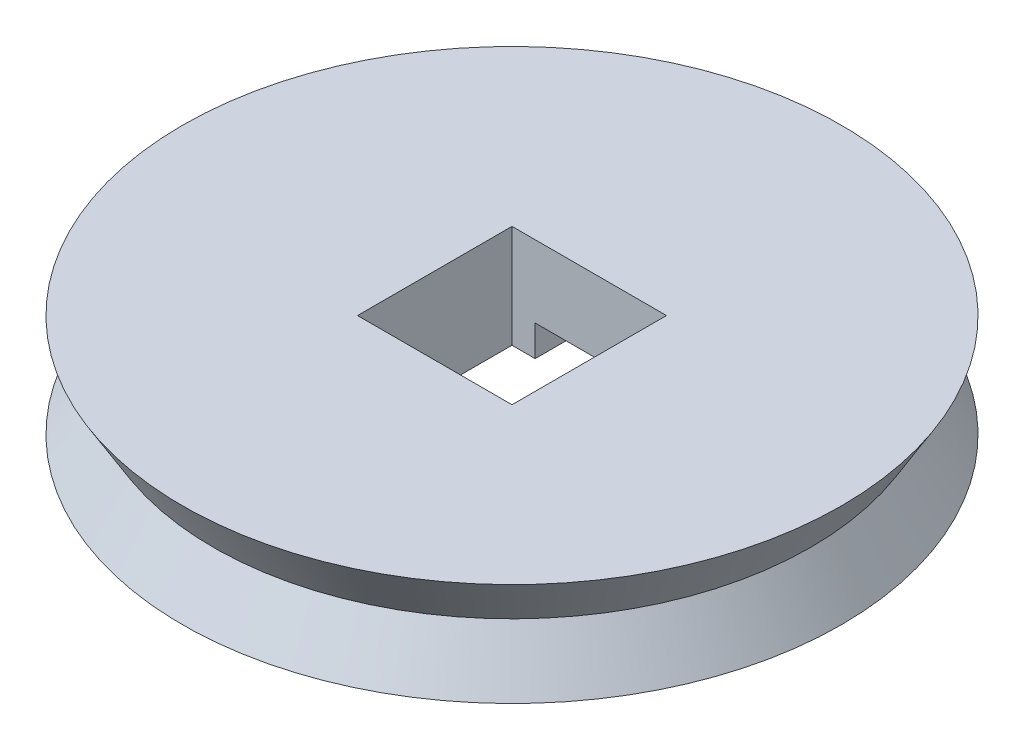
ISO-10303-21;
HEADER;
FILE_DESCRIPTION(('STEP AP214'),'2;1');
FILE_NAME('part.step','',(''),(''),'','','');
FILE_SCHEMA(('AUTOMOTIVE_DESIGN { 1 0 10303 214 1 1 1 1 }'));
ENDSEC;
DATA;
#1=APPLICATION_CONTEXT('core data for automotive mechanical design processes');
#2=APPLICATION_PROTOCOL_DEFINITION('international standard','automotive_design',2000,#1);
#3=PRODUCT_CONTEXT('',#1,'mechanical');
#4=PRODUCT('Part','Part','',(#3));
#5=PRODUCT_RELATED_PRODUCT_CATEGORY('part','',(#4));
#6=PRODUCT_DEFINITION_FORMATION('','',#4);
#7=PRODUCT_DEFINITION_CONTEXT('part definition',#1,'design');
#8=PRODUCT_DEFINITION('design','',#6,#7);
#9=PRODUCT_DEFINITION_SHAPE('','',#8);
#10=(LENGTH_UNIT() NAMED_UNIT(*) SI_UNIT(.MILLI.,.METRE.));
#11=(NAMED_UNIT(*) PLANE_ANGLE_UNIT() SI_UNIT($,.RADIAN.));
#12=(NAMED_UNIT(*) SI_UNIT($,.STERADIAN.) SOLID_ANGLE_UNIT());
#13=UNCERTAINTY_MEASURE_WITH_UNIT(LENGTH_MEASURE(1.E-05),#10,'distance_accuracy_value','');
#14=(GEOMETRIC_REPRESENTATION_CONTEXT(3) GLOBAL_UNCERTAINTY_ASSIGNED_CONTEXT((#13)) GLOBAL_UNIT_ASSIGNED_CONTEXT((#10,
#11,#12)) REPRESENTATION_CONTEXT('',''));
#15=CARTESIAN_POINT('',(0.,0.,0.));
#16=DIRECTION('',(0.,0.,1.));
#17=DIRECTION('',(1.,0.,0.));
#18=AXIS2_PLACEMENT_3D('',#15,#16,#17);
#19=CARTESIAN_POINT('',(0.,0.,0.));
#20=DIRECTION('',(0.,1.,0.));
#21=DIRECTION('',(0.,0.,1.));
#22=AXIS2_PLACEMENT_3D('',#19,#20,#21);
#23=PLANE('',#22);
#24=CARTESIAN_POINT('',(0.,0.,0.));
#25=DIRECTION('',(0.,1.,0.));
#26=DIRECTION('',(0.,0.,1.));
#27=AXIS2_PLACEMENT_3D('',#24,#25,#26);
#28=CIRCLE('',#27,32.);
#29=CARTESIAN_POINT('',(32.,0.,0.));
#30=VERTEX_POINT('',#29);
#31=EDGE_CURVE('E45',#30,#30,#28,.T.);
#32=ORIENTED_EDGE('',*,*,#31,.F.);
#33=EDGE_LOOP('',(#32));
#34=FACE_BOUND('',#33,.T.);
#35=DIRECTION('',(0.,0.,1.));
#36=VECTOR('',#35,1.);
#37=CARTESIAN_POINT('',(5.25,0.,7.5));
#38=LINE('',#37,#36);
#39=CARTESIAN_POINT('',(5.25,0.,7.5));
#40=VERTEX_POINT('',#39);
#41=CARTESIAN_POINT('',(5.25,0.,18.));
#42=VERTEX_POINT('',#41);
#43=EDGE_CURVE('E144',#40,#42,#38,.T.);
#44=ORIENTED_EDGE('',*,*,#43,.F.);
#45=DIRECTION('',(1.,0.,0.));
#46=VECTOR('',#45,1.);
#47=CARTESIAN_POINT('',(-7.5,0.,7.5));
#48=LINE('',#47,#46);
#49=CARTESIAN_POINT('',(7.5,0.,7.5));
#50=VERTEX_POINT('',#49);
#51=EDGE_CURVE('E209',#40,#50,#48,.T.);
#52=ORIENTED_EDGE('',*,*,#51,.T.);
#53=DIRECTION('',(0.,0.,-1.));
#54=VECTOR('',#53,1.);
#55=CARTESIAN_POINT('',(7.5,0.,7.5));
#56=LINE('',#55,#54);
#57=CARTESIAN_POINT('',(7.5,0.,-7.5));
#58=VERTEX_POINT('',#57);
#59=EDGE_CURVE('E200',#50,#58,#56,.T.);
#60=ORIENTED_EDGE('',*,*,#59,.T.);
#61=DIRECTION('',(-1.,0.,0.));
#62=VECTOR('',#61,1.);
#63=CARTESIAN_POINT('',(-7.5,0.,-7.5));
#64=LINE('',#63,#62);
#65=CARTESIAN_POINT('',(5.25,0.,-7.5));
#66=VERTEX_POINT('',#65);
#67=EDGE_CURVE('E204',#58,#66,#64,.T.);
#68=ORIENTED_EDGE('',*,*,#67,.T.);
#69=DIRECTION('',(0.,0.,1.));
#70=VECTOR('',#69,1.);
#71=CARTESIAN_POINT('',(5.25,0.,-7.5));
#72=LINE('',#71,#70);
#73=CARTESIAN_POINT('',(5.25,0.,-18.));
#74=VERTEX_POINT('',#73);
#75=EDGE_CURVE('E167',#74,#66,#72,.T.);
#76=ORIENTED_EDGE('',*,*,#75,.F.);
#77=DIRECTION('',(1.,0.,0.));
#78=VECTOR('',#77,1.);
#79=CARTESIAN_POINT('',(5.25,0.,-18.));
#80=LINE('',#79,#78);
#81=CARTESIAN_POINT('',(-5.24999999999999,0.,-18.));
#82=VERTEX_POINT('',#81);
#83=EDGE_CURVE('E183',#82,#74,#80,.T.);
#84=ORIENTED_EDGE('',*,*,#83,.F.);
#85=DIRECTION('',(0.,0.,-1.));
#86=VECTOR('',#85,1.);
#87=CARTESIAN_POINT('',(-5.25,0.,-7.5));
#88=LINE('',#87,#86);
#89=CARTESIAN_POINT('',(-5.25,0.,-7.5));
#90=VERTEX_POINT('',#89);
#91=EDGE_CURVE('E189',#90,#82,#88,.T.);
#92=ORIENTED_EDGE('',*,*,#91,.F.);
#93=CARTESIAN_POINT('',(-7.5,0.,-7.5));
#94=VERTEX_POINT('',#93);
#95=EDGE_CURVE('E205',#90,#94,#64,.T.);
#96=ORIENTED_EDGE('',*,*,#95,.T.);
#97=DIRECTION('',(0.,0.,1.));
#98=VECTOR('',#97,1.);
#99=CARTESIAN_POINT('',(-7.5,0.,7.5));
#100=LINE('',#99,#98);
#101=CARTESIAN_POINT('',(-7.5,0.,7.5));
#102=VERTEX_POINT('',#101);
#103=EDGE_CURVE('E210',#94,#102,#100,.T.);
#104=ORIENTED_EDGE('',*,*,#103,.T.);
#105=CARTESIAN_POINT('',(-5.25,0.,7.5));
#106=VERTEX_POINT('',#105);
#107=EDGE_CURVE('E211',#102,#106,#48,.T.);
#108=ORIENTED_EDGE('',*,*,#107,.T.);
#109=DIRECTION('',(0.,0.,-1.));
#110=VECTOR('',#109,1.);
#111=CARTESIAN_POINT('',(-5.25,0.,7.5));
#112=LINE('',#111,#110);
#113=CARTESIAN_POINT('',(-5.25,0.,18.));
#114=VERTEX_POINT('',#113);
#115=EDGE_CURVE('E158',#114,#106,#112,.T.);
#116=ORIENTED_EDGE('',*,*,#115,.F.);
#117=DIRECTION('',(-1.,0.,0.));
#118=VECTOR('',#117,1.);
#119=CARTESIAN_POINT('',(5.25,0.,18.));
#120=LINE('',#119,#118);
#121=EDGE_CURVE('E159',#42,#114,#120,.T.);
#122=ORIENTED_EDGE('',*,*,#121,.F.);
#123=EDGE_LOOP('',(#44,#52,#60,#68,#76,#84,#92,#96,#104,#108,#116,#122));
#124=FACE_BOUND('',#123,.T.);
#125=ADVANCED_FACE('F39',(#34,#124),#23,.F.);
#126=CARTESIAN_POINT('',(0.,10.,0.));
#127=DIRECTION('',(0.,1.,0.));
#128=DIRECTION('',(0.,0.,1.));
#129=AXIS2_PLACEMENT_3D('',#126,#127,#128);
#130=PLANE('',#129);
#131=DIRECTION('',(0.,0.,-1.));
#132=VECTOR('',#131,1.);
#133=CARTESIAN_POINT('',(7.5,10.,7.5));
#134=LINE('',#133,#132);
#135=CARTESIAN_POINT('',(7.5,10.,7.5));
#136=VERTEX_POINT('',#135);
#137=CARTESIAN_POINT('',(7.5,10.,-7.5));
#138=VERTEX_POINT('',#137);
#139=EDGE_CURVE('E168',#136,#138,#134,.T.);
#140=ORIENTED_EDGE('',*,*,#139,.F.);
#141=DIRECTION('',(1.,0.,0.));
#142=VECTOR('',#141,1.);
#143=CARTESIAN_POINT('',(-7.5,10.,7.5));
#144=LINE('',#143,#142);
#145=CARTESIAN_POINT('',(-7.5,10.,7.5));
#146=VERTEX_POINT('',#145);
#147=EDGE_CURVE('E201',#146,#136,#144,.T.);
#148=ORIENTED_EDGE('',*,*,#147,.F.);
#149=DIRECTION('',(0.,0.,1.));
#150=VECTOR('',#149,1.);
#151=CARTESIAN_POINT('',(-7.5,10.,7.5));
#152=LINE('',#151,#150);
#153=CARTESIAN_POINT('',(-7.5,10.,-7.5));
#154=VERTEX_POINT('',#153);
#155=EDGE_CURVE('E218',#154,#146,#152,.T.);
#156=ORIENTED_EDGE('',*,*,#155,.F.);
#157=DIRECTION('',(-1.,0.,0.));
#158=VECTOR('',#157,1.);
#159=CARTESIAN_POINT('',(-7.5,10.,-7.5));
#160=LINE('',#159,#158);
#161=EDGE_CURVE('E216',#138,#154,#160,.T.);
#162=ORIENTED_EDGE('',*,*,#161,.F.);
#163=EDGE_LOOP('',(#140,#148,#156,#162));
#164=FACE_BOUND('',#163,.T.);
#165=CARTESIAN_POINT('',(0.,10.,0.));
#166=DIRECTION('',(0.,1.,0.));
#167=DIRECTION('',(0.,0.,1.));
#168=AXIS2_PLACEMENT_3D('',#165,#166,#167);
#169=CIRCLE('',#168,32.);
#170=CARTESIAN_POINT('',(32.,10.,0.));
#171=VERTEX_POINT('',#170);
#172=EDGE_CURVE('E11',#171,#171,#169,.T.);
#173=ORIENTED_EDGE('',*,*,#172,.T.);
#174=EDGE_LOOP('',(#173));
#175=FACE_BOUND('',#174,.T.);
#176=ADVANCED_FACE('F247',(#164,#175),#130,.T.);
#177=CARTESIAN_POINT('',(0.,10.,0.));
#178=DIRECTION('',(0.,1.,0.));
#179=DIRECTION('',(0.,0.,1.));
#180=AXIS2_PLACEMENT_3D('',#177,#178,#179);
#181=CONICAL_SURFACE('',#180,32.,0.540419500270584);
#182=DIRECTION('',(-0.514495755427526,-0.857492925712544,0.));
#183=VECTOR('',#182,1.);
#184=CARTESIAN_POINT('',(32.,10.,0.));
#185=LINE('',#184,#183);
#186=CARTESIAN_POINT('',(29.,5.,0.));
#187=VERTEX_POINT('',#186);
#188=EDGE_CURVE('E226',#171,#187,#185,.T.);
#189=ORIENTED_EDGE('',*,*,#188,.F.);
#190=ORIENTED_EDGE('',*,*,#172,.F.);
#191=ORIENTED_EDGE('',*,*,#188,.T.);
#192=CARTESIAN_POINT('',(0.,5.,0.));
#193=DIRECTION('',(0.,1.,0.));
#194=DIRECTION('',(1.,0.,0.));
#195=AXIS2_PLACEMENT_3D('',#192,#193,#194);
#196=CIRCLE('',#195,29.);
#197=EDGE_CURVE('E234',#187,#187,#196,.T.);
#198=ORIENTED_EDGE('',*,*,#197,.T.);
#199=EDGE_LOOP('',(#189,#190,#191,#198));
#200=FACE_BOUND('',#199,.T.);
#201=ADVANCED_FACE('F245',(#200),#181,.T.);
#202=CARTESIAN_POINT('',(0.,5.,0.));
#203=DIRECTION('',(0.,-1.,0.));
#204=DIRECTION('',(0.,0.,-1.));
#205=AXIS2_PLACEMENT_3D('',#202,#203,#204);
#206=CONICAL_SURFACE('',#205,29.,0.540419500270584);
#207=DIRECTION('',(0.514495755427526,-0.857492925712544,0.));
#208=VECTOR('',#207,1.);
#209=CARTESIAN_POINT('',(29.,5.,0.));
#210=LINE('',#209,#208);
#211=EDGE_CURVE('E233',#187,#30,#210,.T.);
#212=ORIENTED_EDGE('',*,*,#211,.F.);
#213=ORIENTED_EDGE('',*,*,#197,.F.);
#214=ORIENTED_EDGE('',*,*,#211,.T.);
#215=ORIENTED_EDGE('',*,*,#31,.T.);
#216=EDGE_LOOP('',(#212,#213,#214,#215));
#217=FACE_BOUND('',#216,.T.);
#218=ADVANCED_FACE('F242',(#217),#206,.T.);
#219=CARTESIAN_POINT('',(7.5,0.,7.5));
#220=DIRECTION('',(1.,0.,0.));
#221=DIRECTION('',(0.,0.,-1.));
#222=AXIS2_PLACEMENT_3D('',#219,#220,#221);
#223=PLANE('',#222);
#224=ORIENTED_EDGE('',*,*,#139,.T.);
#225=DIRECTION('',(0.,1.,0.));
#226=VECTOR('',#225,1.);
#227=CARTESIAN_POINT('',(7.5,0.,-7.5));
#228=LINE('',#227,#226);
#229=EDGE_CURVE('E212',#58,#138,#228,.T.);
#230=ORIENTED_EDGE('',*,*,#229,.F.);
#231=ORIENTED_EDGE('',*,*,#59,.F.);
#232=DIRECTION('',(0.,1.,0.));
#233=VECTOR('',#232,1.);
#234=CARTESIAN_POINT('',(7.5,0.,7.5));
#235=LINE('',#234,#233);
#236=EDGE_CURVE('E221',#50,#136,#235,.T.);
#237=ORIENTED_EDGE('',*,*,#236,.T.);
#238=EDGE_LOOP('',(#224,#230,#231,#237));
#239=FACE_BOUND('',#238,.T.);
#240=ADVANCED_FACE('F261',(#239),#223,.F.);
#241=CARTESIAN_POINT('',(-7.5,0.,7.5));
#242=DIRECTION('',(0.,0.,1.));
#243=DIRECTION('',(1.,0.,0.));
#244=AXIS2_PLACEMENT_3D('',#241,#242,#243);
#245=PLANE('',#244);
#246=DIRECTION('',(1.,0.,0.));
#247=VECTOR('',#246,1.);
#248=CARTESIAN_POINT('',(5.25,3.,7.5));
#249=LINE('',#248,#247);
#250=CARTESIAN_POINT('',(-5.25,3.,7.5));
#251=VERTEX_POINT('',#250);
#252=CARTESIAN_POINT('',(5.25,3.,7.5));
#253=VERTEX_POINT('',#252);
#254=EDGE_CURVE('E147',#251,#253,#249,.T.);
#255=ORIENTED_EDGE('',*,*,#254,.F.);
#256=DIRECTION('',(0.,-1.,0.));
#257=VECTOR('',#256,1.);
#258=CARTESIAN_POINT('',(-5.25,3.,7.5));
#259=LINE('',#258,#257);
#260=EDGE_CURVE('E171',#251,#106,#259,.T.);
#261=ORIENTED_EDGE('',*,*,#260,.T.);
#262=ORIENTED_EDGE('',*,*,#107,.F.);
#263=DIRECTION('',(0.,1.,0.));
#264=VECTOR('',#263,1.);
#265=CARTESIAN_POINT('',(-7.5,0.,7.5));
#266=LINE('',#265,#264);
#267=EDGE_CURVE('E227',#102,#146,#266,.T.);
#268=ORIENTED_EDGE('',*,*,#267,.T.);
#269=ORIENTED_EDGE('',*,*,#147,.T.);
#270=ORIENTED_EDGE('',*,*,#236,.F.);
#271=ORIENTED_EDGE('',*,*,#51,.F.);
#272=DIRECTION('',(0.,-1.,0.));
#273=VECTOR('',#272,1.);
#274=CARTESIAN_POINT('',(5.25,3.,7.5));
#275=LINE('',#274,#273);
#276=EDGE_CURVE('E169',#253,#40,#275,.T.);
#277=ORIENTED_EDGE('',*,*,#276,.F.);
#278=EDGE_LOOP('',(#255,#261,#262,#268,#269,#270,#271,#277));
#279=FACE_BOUND('',#278,.T.);
#280=ADVANCED_FACE('F262',(#279),#245,.F.);
#281=CARTESIAN_POINT('',(-7.5,0.,7.5));
#282=DIRECTION('',(-1.,0.,0.));
#283=DIRECTION('',(0.,0.,1.));
#284=AXIS2_PLACEMENT_3D('',#281,#282,#283);
#285=PLANE('',#284);
#286=ORIENTED_EDGE('',*,*,#155,.T.);
#287=ORIENTED_EDGE('',*,*,#267,.F.);
#288=ORIENTED_EDGE('',*,*,#103,.F.);
#289=DIRECTION('',(0.,1.,0.));
#290=VECTOR('',#289,1.);
#291=CARTESIAN_POINT('',(-7.5,0.,-7.5));
#292=LINE('',#291,#290);
#293=EDGE_CURVE('E228',#94,#154,#292,.T.);
#294=ORIENTED_EDGE('',*,*,#293,.T.);
#295=EDGE_LOOP('',(#286,#287,#288,#294));
#296=FACE_BOUND('',#295,.T.);
#297=ADVANCED_FACE('F269',(#296),#285,.F.);
#298=CARTESIAN_POINT('',(-7.5,0.,-7.5));
#299=DIRECTION('',(0.,0.,-1.));
#300=DIRECTION('',(-1.,0.,0.));
#301=AXIS2_PLACEMENT_3D('',#298,#299,#300);
#302=PLANE('',#301);
#303=DIRECTION('',(-1.,0.,0.));
#304=VECTOR('',#303,1.);
#305=CARTESIAN_POINT('',(5.25,3.,-7.5));
#306=LINE('',#305,#304);
#307=CARTESIAN_POINT('',(5.25,3.,-7.5));
#308=VERTEX_POINT('',#307);
#309=CARTESIAN_POINT('',(-5.25,3.,-7.5));
#310=VERTEX_POINT('',#309);
#311=EDGE_CURVE('E198',#308,#310,#306,.T.);
#312=ORIENTED_EDGE('',*,*,#311,.F.);
#313=DIRECTION('',(0.,-1.,0.));
#314=VECTOR('',#313,1.);
#315=CARTESIAN_POINT('',(5.25,3.,-7.5));
#316=LINE('',#315,#314);
#317=EDGE_CURVE('E175',#308,#66,#316,.T.);
#318=ORIENTED_EDGE('',*,*,#317,.T.);
#319=ORIENTED_EDGE('',*,*,#67,.F.);
#320=ORIENTED_EDGE('',*,*,#229,.T.);
#321=ORIENTED_EDGE('',*,*,#161,.T.);
#322=ORIENTED_EDGE('',*,*,#293,.F.);
#323=ORIENTED_EDGE('',*,*,#95,.F.);
#324=DIRECTION('',(0.,-1.,0.));
#325=VECTOR('',#324,1.);
#326=CARTESIAN_POINT('',(-5.25,3.,-7.5));
#327=LINE('',#326,#325);
#328=EDGE_CURVE('E178',#310,#90,#327,.T.);
#329=ORIENTED_EDGE('',*,*,#328,.F.);
#330=EDGE_LOOP('',(#312,#318,#319,#320,#321,#322,#323,#329));
#331=FACE_BOUND('',#330,.T.);
#332=ADVANCED_FACE('F266',(#331),#302,.F.);
#333=CARTESIAN_POINT('',(5.25,3.,-7.5));
#334=DIRECTION('',(1.,0.,0.));
#335=DIRECTION('',(0.,0.,-1.));
#336=AXIS2_PLACEMENT_3D('',#333,#334,#335);
#337=PLANE('',#336);
#338=ORIENTED_EDGE('',*,*,#75,.T.);
#339=ORIENTED_EDGE('',*,*,#317,.F.);
#340=DIRECTION('',(0.,0.,1.));
#341=VECTOR('',#340,1.);
#342=CARTESIAN_POINT('',(5.25,3.,-7.5));
#343=LINE('',#342,#341);
#344=CARTESIAN_POINT('',(5.25,3.,-18.));
#345=VERTEX_POINT('',#344);
#346=EDGE_CURVE('E61',#345,#308,#343,.T.);
#347=ORIENTED_EDGE('',*,*,#346,.F.);
#348=DIRECTION('',(0.,-1.,0.));
#349=VECTOR('',#348,1.);
#350=CARTESIAN_POINT('',(5.25,3.,-18.));
#351=LINE('',#350,#349);
#352=EDGE_CURVE('E181',#345,#74,#351,.T.);
#353=ORIENTED_EDGE('',*,*,#352,.T.);
#354=EDGE_LOOP('',(#338,#339,#347,#353));
#355=FACE_BOUND('',#354,.T.);
#356=ADVANCED_FACE('F267',(#355),#337,.F.);
#357=CARTESIAN_POINT('',(5.25,3.,-18.));
#358=DIRECTION('',(0.,0.,-1.));
#359=DIRECTION('',(-1.,0.,0.));
#360=AXIS2_PLACEMENT_3D('',#357,#358,#359);
#361=PLANE('',#360);
#362=ORIENTED_EDGE('',*,*,#83,.T.);
#363=ORIENTED_EDGE('',*,*,#352,.F.);
#364=DIRECTION('',(1.,0.,0.));
#365=VECTOR('',#364,1.);
#366=CARTESIAN_POINT('',(5.25,3.,-18.));
#367=LINE('',#366,#365);
#368=CARTESIAN_POINT('',(-5.24999999999999,3.,-18.));
#369=VERTEX_POINT('',#368);
#370=EDGE_CURVE('E177',#369,#345,#367,.T.);
#371=ORIENTED_EDGE('',*,*,#370,.F.);
#372=DIRECTION('',(0.,-1.,0.));
#373=VECTOR('',#372,1.);
#374=CARTESIAN_POINT('',(-5.24999999999999,3.,-18.));
#375=LINE('',#374,#373);
#376=EDGE_CURVE('E182',#369,#82,#375,.T.);
#377=ORIENTED_EDGE('',*,*,#376,.T.);
#378=EDGE_LOOP('',(#362,#363,#371,#377));
#379=FACE_BOUND('',#378,.T.);
#380=ADVANCED_FACE('F282',(#379),#361,.F.);
#381=CARTESIAN_POINT('',(-5.25,3.,-7.5));
#382=DIRECTION('',(-1.,0.,0.));
#383=DIRECTION('',(0.,0.,1.));
#384=AXIS2_PLACEMENT_3D('',#381,#382,#383);
#385=PLANE('',#384);
#386=ORIENTED_EDGE('',*,*,#91,.T.);
#387=ORIENTED_EDGE('',*,*,#376,.F.);
#388=DIRECTION('',(0.,0.,-1.));
#389=VECTOR('',#388,1.);
#390=CARTESIAN_POINT('',(-5.25,3.,-7.5));
#391=LINE('',#390,#389);
#392=EDGE_CURVE('E192',#310,#369,#391,.T.);
#393=ORIENTED_EDGE('',*,*,#392,.F.);
#394=ORIENTED_EDGE('',*,*,#328,.T.);
#395=EDGE_LOOP('',(#386,#387,#393,#394));
#396=FACE_BOUND('',#395,.T.);
#397=ADVANCED_FACE('F281',(#396),#385,.F.);
#398=CARTESIAN_POINT('',(0.,3.,0.));
#399=DIRECTION('',(0.,1.,0.));
#400=DIRECTION('',(0.,0.,1.));
#401=AXIS2_PLACEMENT_3D('',#398,#399,#400);
#402=PLANE('',#401);
#403=ORIENTED_EDGE('',*,*,#346,.T.);
#404=ORIENTED_EDGE('',*,*,#311,.T.);
#405=ORIENTED_EDGE('',*,*,#392,.T.);
#406=ORIENTED_EDGE('',*,*,#370,.T.);
#407=EDGE_LOOP('',(#403,#404,#405,#406));
#408=FACE_BOUND('',#407,.T.);
#409=ADVANCED_FACE('F279',(#408),#402,.F.);
#410=CARTESIAN_POINT('',(5.25,3.,7.5));
#411=DIRECTION('',(1.,0.,0.));
#412=DIRECTION('',(0.,0.,-1.));
#413=AXIS2_PLACEMENT_3D('',#410,#411,#412);
#414=PLANE('',#413);
#415=ORIENTED_EDGE('',*,*,#43,.T.);
#416=DIRECTION('',(0.,-1.,0.));
#417=VECTOR('',#416,1.);
#418=CARTESIAN_POINT('',(5.25,3.,18.));
#419=LINE('',#418,#417);
#420=CARTESIAN_POINT('',(5.25,3.,18.));
#421=VERTEX_POINT('',#420);
#422=EDGE_CURVE('E138',#421,#42,#419,.T.);
#423=ORIENTED_EDGE('',*,*,#422,.F.);
#424=DIRECTION('',(0.,0.,1.));
#425=VECTOR('',#424,1.);
#426=CARTESIAN_POINT('',(5.25,3.,7.5));
#427=LINE('',#426,#425);
#428=EDGE_CURVE('E141',#253,#421,#427,.T.);
#429=ORIENTED_EDGE('',*,*,#428,.F.);
#430=ORIENTED_EDGE('',*,*,#276,.T.);
#431=EDGE_LOOP('',(#415,#423,#429,#430));
#432=FACE_BOUND('',#431,.T.);
#433=ADVANCED_FACE('F143',(#432),#414,.F.);
#434=CARTESIAN_POINT('',(-5.25,3.,7.5));
#435=DIRECTION('',(-1.,0.,0.));
#436=DIRECTION('',(0.,0.,1.));
#437=AXIS2_PLACEMENT_3D('',#434,#435,#436);
#438=PLANE('',#437);
#439=ORIENTED_EDGE('',*,*,#115,.T.);
#440=ORIENTED_EDGE('',*,*,#260,.F.);
#441=DIRECTION('',(0.,0.,-1.));
#442=VECTOR('',#441,1.);
#443=CARTESIAN_POINT('',(-5.25,3.,7.5));
#444=LINE('',#443,#442);
#445=CARTESIAN_POINT('',(-5.25,3.,18.));
#446=VERTEX_POINT('',#445);
#447=EDGE_CURVE('E52',#446,#251,#444,.T.);
#448=ORIENTED_EDGE('',*,*,#447,.F.);
#449=DIRECTION('',(0.,-1.,0.));
#450=VECTOR('',#449,1.);
#451=CARTESIAN_POINT('',(-5.25,3.,18.));
#452=LINE('',#451,#450);
#453=EDGE_CURVE('E149',#446,#114,#452,.T.);
#454=ORIENTED_EDGE('',*,*,#453,.T.);
#455=EDGE_LOOP('',(#439,#440,#448,#454));
#456=FACE_BOUND('',#455,.T.);
#457=ADVANCED_FACE('F294',(#456),#438,.F.);
#458=CARTESIAN_POINT('',(5.25,3.,18.));
#459=DIRECTION('',(0.,0.,1.));
#460=DIRECTION('',(1.,0.,0.));
#461=AXIS2_PLACEMENT_3D('',#458,#459,#460);
#462=PLANE('',#461);
#463=ORIENTED_EDGE('',*,*,#121,.T.);
#464=ORIENTED_EDGE('',*,*,#453,.F.);
#465=DIRECTION('',(-1.,0.,0.));
#466=VECTOR('',#465,1.);
#467=CARTESIAN_POINT('',(5.25,3.,18.));
#468=LINE('',#467,#466);
#469=EDGE_CURVE('E155',#421,#446,#468,.T.);
#470=ORIENTED_EDGE('',*,*,#469,.F.);
#471=ORIENTED_EDGE('',*,*,#422,.T.);
#472=EDGE_LOOP('',(#463,#464,#470,#471));
#473=FACE_BOUND('',#472,.T.);
#474=ADVANCED_FACE('F153',(#473),#462,.F.);
#475=CARTESIAN_POINT('',(0.,3.,0.));
#476=DIRECTION('',(0.,-1.,0.));
#477=DIRECTION('',(0.,0.,-1.));
#478=AXIS2_PLACEMENT_3D('',#475,#476,#477);
#479=PLANE('',#478);
#480=ORIENTED_EDGE('',*,*,#428,.T.);
#481=ORIENTED_EDGE('',*,*,#469,.T.);
#482=ORIENTED_EDGE('',*,*,#447,.T.);
#483=ORIENTED_EDGE('',*,*,#254,.T.);
#484=EDGE_LOOP('',(#480,#481,#482,#483));
#485=FACE_BOUND('',#484,.T.);
#486=ADVANCED_FACE('F154',(#485),#479,.T.);
#487=CLOSED_SHELL('',(#125,#176,#201,#218,#240,#280,#297,#332,#356,#380,#397,#409,#433,#457,
#474,#486));
#488=MANIFOLD_SOLID_BREP('B2',#487);
#489=ADVANCED_BREP_SHAPE_REPRESENTATION('',(#18,#488),#14);
#490=SHAPE_DEFINITION_REPRESENTATION(#9,#489);
ENDSEC;
END-ISO-10303-21;
